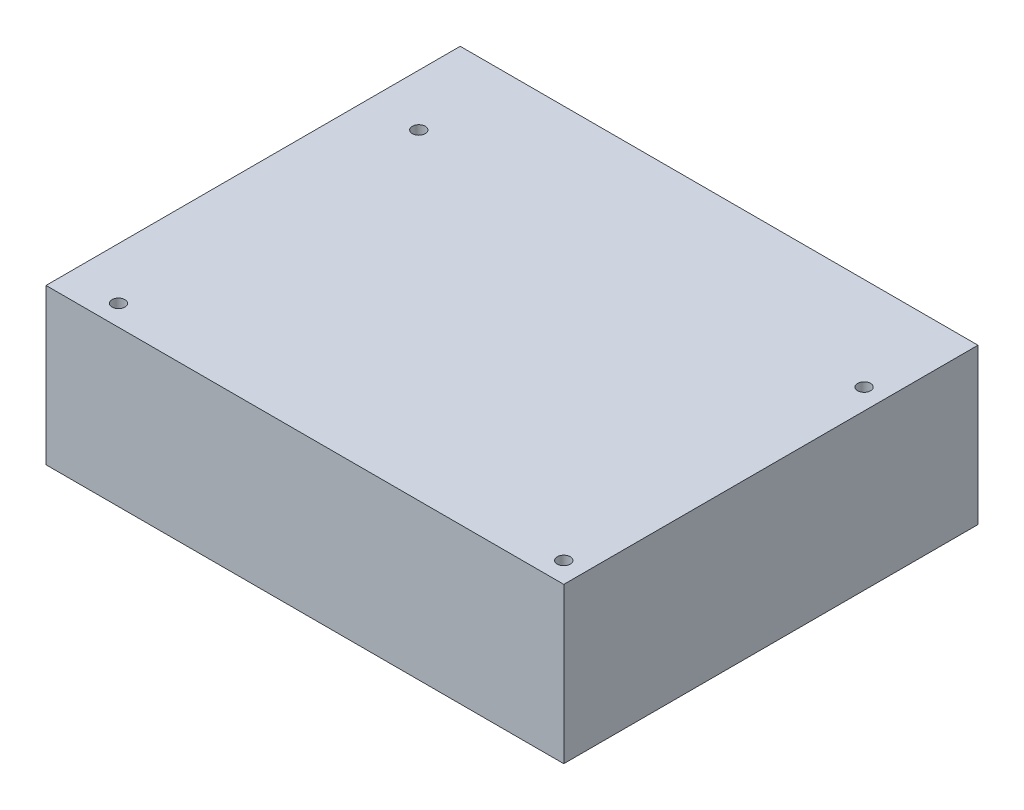
ISO-10303-21;
HEADER;
FILE_DESCRIPTION(('STEP AP214'),'2;1');
FILE_NAME('part.step','',(''),(''),'','','');
FILE_SCHEMA(('AUTOMOTIVE_DESIGN { 1 0 10303 214 1 1 1 1 }'));
ENDSEC;
DATA;
#1=APPLICATION_CONTEXT('core data for automotive mechanical design processes');
#2=APPLICATION_PROTOCOL_DEFINITION('international standard','automotive_design',2000,#1);
#3=PRODUCT_CONTEXT('',#1,'mechanical');
#4=PRODUCT('Part','Part','',(#3));
#5=PRODUCT_RELATED_PRODUCT_CATEGORY('part','',(#4));
#6=PRODUCT_DEFINITION_FORMATION('','',#4);
#7=PRODUCT_DEFINITION_CONTEXT('part definition',#1,'design');
#8=PRODUCT_DEFINITION('design','',#6,#7);
#9=PRODUCT_DEFINITION_SHAPE('','',#8);
#10=(LENGTH_UNIT() NAMED_UNIT(*) SI_UNIT(.MILLI.,.METRE.));
#11=(NAMED_UNIT(*) PLANE_ANGLE_UNIT() SI_UNIT($,.RADIAN.));
#12=(NAMED_UNIT(*) SI_UNIT($,.STERADIAN.) SOLID_ANGLE_UNIT());
#13=UNCERTAINTY_MEASURE_WITH_UNIT(LENGTH_MEASURE(1.E-05),#10,'distance_accuracy_value','');
#14=(GEOMETRIC_REPRESENTATION_CONTEXT(3) GLOBAL_UNCERTAINTY_ASSIGNED_CONTEXT((#13)) GLOBAL_UNIT_ASSIGNED_CONTEXT((#10,
#11,#12)) REPRESENTATION_CONTEXT('',''));
#15=CARTESIAN_POINT('',(0.,0.,0.));
#16=DIRECTION('',(0.,0.,1.));
#17=DIRECTION('',(1.,0.,0.));
#18=AXIS2_PLACEMENT_3D('',#15,#16,#17);
#19=CARTESIAN_POINT('',(50.,30.,40.));
#20=DIRECTION('',(-1.,0.,0.));
#21=DIRECTION('',(0.,0.,1.));
#22=AXIS2_PLACEMENT_3D('',#19,#20,#21);
#23=PLANE('',#22);
#24=DIRECTION('',(0.,0.,-1.));
#25=VECTOR('',#24,1.);
#26=CARTESIAN_POINT('',(50.,0.,40.));
#27=LINE('',#26,#25);
#28=CARTESIAN_POINT('',(50.,0.,40.));
#29=VERTEX_POINT('',#28);
#30=CARTESIAN_POINT('',(50.,0.,-40.));
#31=VERTEX_POINT('',#30);
#32=EDGE_CURVE('E313',#29,#31,#27,.T.);
#33=ORIENTED_EDGE('',*,*,#32,.T.);
#34=DIRECTION('',(0.,-1.,0.));
#35=VECTOR('',#34,1.);
#36=CARTESIAN_POINT('',(50.,30.,-40.));
#37=LINE('',#36,#35);
#38=CARTESIAN_POINT('',(50.,30.,-40.));
#39=VERTEX_POINT('',#38);
#40=EDGE_CURVE('E11',#39,#31,#37,.T.);
#41=ORIENTED_EDGE('',*,*,#40,.F.);
#42=DIRECTION('',(0.,0.,-1.));
#43=VECTOR('',#42,1.);
#44=CARTESIAN_POINT('',(50.,30.,40.));
#45=LINE('',#44,#43);
#46=CARTESIAN_POINT('',(50.,30.,40.));
#47=VERTEX_POINT('',#46);
#48=EDGE_CURVE('E316',#47,#39,#45,.T.);
#49=ORIENTED_EDGE('',*,*,#48,.F.);
#50=DIRECTION('',(0.,-1.,0.));
#51=VECTOR('',#50,1.);
#52=CARTESIAN_POINT('',(50.,30.,40.));
#53=LINE('',#52,#51);
#54=EDGE_CURVE('E326',#47,#29,#53,.T.);
#55=ORIENTED_EDGE('',*,*,#54,.T.);
#56=EDGE_LOOP('',(#33,#41,#49,#55));
#57=FACE_BOUND('',#56,.T.);
#58=ADVANCED_FACE('F41',(#57),#23,.F.);
#59=CARTESIAN_POINT('',(-50.,30.,-40.));
#60=DIRECTION('',(0.,0.,1.));
#61=DIRECTION('',(1.,0.,0.));
#62=AXIS2_PLACEMENT_3D('',#59,#60,#61);
#63=PLANE('',#62);
#64=DIRECTION('',(1.,0.,0.));
#65=VECTOR('',#64,1.);
#66=CARTESIAN_POINT('',(-5.,21.,-40.));
#67=LINE('',#66,#65);
#68=CARTESIAN_POINT('',(-20.,21.,-40.));
#69=VERTEX_POINT('',#68);
#70=CARTESIAN_POINT('',(-5.,21.,-40.));
#71=VERTEX_POINT('',#70);
#72=EDGE_CURVE('E236',#69,#71,#67,.T.);
#73=ORIENTED_EDGE('',*,*,#72,.F.);
#74=DIRECTION('',(0.,1.,0.));
#75=VECTOR('',#74,1.);
#76=CARTESIAN_POINT('',(-20.,15.,-40.));
#77=LINE('',#76,#75);
#78=CARTESIAN_POINT('',(-20.,15.,-40.));
#79=VERTEX_POINT('',#78);
#80=EDGE_CURVE('E55',#79,#69,#77,.T.);
#81=ORIENTED_EDGE('',*,*,#80,.F.);
#82=DIRECTION('',(-1.,0.,0.));
#83=VECTOR('',#82,1.);
#84=CARTESIAN_POINT('',(-5.,15.,-40.));
#85=LINE('',#84,#83);
#86=CARTESIAN_POINT('',(-5.,15.,-40.));
#87=VERTEX_POINT('',#86);
#88=EDGE_CURVE('E229',#87,#79,#85,.T.);
#89=ORIENTED_EDGE('',*,*,#88,.F.);
#90=DIRECTION('',(0.,-1.,0.));
#91=VECTOR('',#90,1.);
#92=CARTESIAN_POINT('',(-5.,15.,-40.));
#93=LINE('',#92,#91);
#94=EDGE_CURVE('E232',#71,#87,#93,.T.);
#95=ORIENTED_EDGE('',*,*,#94,.F.);
#96=EDGE_LOOP('',(#73,#81,#89,#95));
#97=FACE_BOUND('',#96,.T.);
#98=DIRECTION('',(1.,0.,0.));
#99=VECTOR('',#98,1.);
#100=CARTESIAN_POINT('',(20.,9.,-40.));
#101=LINE('',#100,#99);
#102=CARTESIAN_POINT('',(5.,9.,-40.));
#103=VERTEX_POINT('',#102);
#104=CARTESIAN_POINT('',(20.,9.,-40.));
#105=VERTEX_POINT('',#104);
#106=EDGE_CURVE('E264',#103,#105,#101,.T.);
#107=ORIENTED_EDGE('',*,*,#106,.F.);
#108=DIRECTION('',(0.,1.,0.));
#109=VECTOR('',#108,1.);
#110=CARTESIAN_POINT('',(5.,3.,-40.));
#111=LINE('',#110,#109);
#112=CARTESIAN_POINT('',(5.,3.,-40.));
#113=VERTEX_POINT('',#112);
#114=EDGE_CURVE('E63',#113,#103,#111,.T.);
#115=ORIENTED_EDGE('',*,*,#114,.F.);
#116=DIRECTION('',(-1.,0.,0.));
#117=VECTOR('',#116,1.);
#118=CARTESIAN_POINT('',(20.,3.,-40.));
#119=LINE('',#118,#117);
#120=CARTESIAN_POINT('',(20.,3.,-40.));
#121=VERTEX_POINT('',#120);
#122=EDGE_CURVE('E257',#121,#113,#119,.T.);
#123=ORIENTED_EDGE('',*,*,#122,.F.);
#124=DIRECTION('',(0.,-1.,0.));
#125=VECTOR('',#124,1.);
#126=CARTESIAN_POINT('',(20.,3.,-40.));
#127=LINE('',#126,#125);
#128=EDGE_CURVE('E260',#105,#121,#127,.T.);
#129=ORIENTED_EDGE('',*,*,#128,.F.);
#130=EDGE_LOOP('',(#107,#115,#123,#129));
#131=FACE_BOUND('',#130,.T.);
#132=DIRECTION('',(1.,0.,0.));
#133=VECTOR('',#132,1.);
#134=CARTESIAN_POINT('',(-5.,9.,-40.));
#135=LINE('',#134,#133);
#136=CARTESIAN_POINT('',(-20.,9.,-40.));
#137=VERTEX_POINT('',#136);
#138=CARTESIAN_POINT('',(-5.,9.,-40.));
#139=VERTEX_POINT('',#138);
#140=EDGE_CURVE('E202',#137,#139,#135,.T.);
#141=ORIENTED_EDGE('',*,*,#140,.F.);
#142=DIRECTION('',(0.,1.,0.));
#143=VECTOR('',#142,1.);
#144=CARTESIAN_POINT('',(-20.,3.,-40.));
#145=LINE('',#144,#143);
#146=CARTESIAN_POINT('',(-20.,3.,-40.));
#147=VERTEX_POINT('',#146);
#148=EDGE_CURVE('E180',#147,#137,#145,.T.);
#149=ORIENTED_EDGE('',*,*,#148,.F.);
#150=DIRECTION('',(-1.,0.,0.));
#151=VECTOR('',#150,1.);
#152=CARTESIAN_POINT('',(-5.,3.,-40.));
#153=LINE('',#152,#151);
#154=CARTESIAN_POINT('',(-5.,3.,-40.));
#155=VERTEX_POINT('',#154);
#156=EDGE_CURVE('E191',#155,#147,#153,.T.);
#157=ORIENTED_EDGE('',*,*,#156,.F.);
#158=DIRECTION('',(0.,-1.,0.));
#159=VECTOR('',#158,1.);
#160=CARTESIAN_POINT('',(-5.,3.,-40.));
#161=LINE('',#160,#159);
#162=EDGE_CURVE('E196',#139,#155,#161,.T.);
#163=ORIENTED_EDGE('',*,*,#162,.F.);
#164=EDGE_LOOP('',(#141,#149,#157,#163));
#165=FACE_BOUND('',#164,.T.);
#166=DIRECTION('',(1.,0.,0.));
#167=VECTOR('',#166,1.);
#168=CARTESIAN_POINT('',(20.,21.,-40.));
#169=LINE('',#168,#167);
#170=CARTESIAN_POINT('',(5.,21.,-40.));
#171=VERTEX_POINT('',#170);
#172=CARTESIAN_POINT('',(20.,21.,-40.));
#173=VERTEX_POINT('',#172);
#174=EDGE_CURVE('E293',#171,#173,#169,.T.);
#175=ORIENTED_EDGE('',*,*,#174,.F.);
#176=DIRECTION('',(0.,1.,0.));
#177=VECTOR('',#176,1.);
#178=CARTESIAN_POINT('',(5.,15.,-40.));
#179=LINE('',#178,#177);
#180=CARTESIAN_POINT('',(5.,15.,-40.));
#181=VERTEX_POINT('',#180);
#182=EDGE_CURVE('E240',#181,#171,#179,.T.);
#183=ORIENTED_EDGE('',*,*,#182,.F.);
#184=DIRECTION('',(-1.,0.,0.));
#185=VECTOR('',#184,1.);
#186=CARTESIAN_POINT('',(20.,15.,-40.));
#187=LINE('',#186,#185);
#188=CARTESIAN_POINT('',(20.,15.,-40.));
#189=VERTEX_POINT('',#188);
#190=EDGE_CURVE('E282',#189,#181,#187,.T.);
#191=ORIENTED_EDGE('',*,*,#190,.F.);
#192=DIRECTION('',(0.,-1.,0.));
#193=VECTOR('',#192,1.);
#194=CARTESIAN_POINT('',(20.,15.,-40.));
#195=LINE('',#194,#193);
#196=EDGE_CURVE('E296',#173,#189,#195,.T.);
#197=ORIENTED_EDGE('',*,*,#196,.F.);
#198=EDGE_LOOP('',(#175,#183,#191,#197));
#199=FACE_BOUND('',#198,.T.);
#200=CARTESIAN_POINT('',(41.,9.,-40.));
#201=DIRECTION('',(0.,0.,-1.));
#202=DIRECTION('',(-1.,0.,0.));
#203=AXIS2_PLACEMENT_3D('',#200,#201,#202);
#204=CIRCLE('',#203,5.);
#205=CARTESIAN_POINT('',(36.,9.,-40.));
#206=VERTEX_POINT('',#205);
#207=EDGE_CURVE('E303',#206,#206,#204,.T.);
#208=ORIENTED_EDGE('',*,*,#207,.F.);
#209=EDGE_LOOP('',(#208));
#210=FACE_BOUND('',#209,.T.);
#211=DIRECTION('',(-1.,0.,0.));
#212=VECTOR('',#211,1.);
#213=CARTESIAN_POINT('',(-50.,0.,-40.));
#214=LINE('',#213,#212);
#215=CARTESIAN_POINT('',(-50.,0.,-40.));
#216=VERTEX_POINT('',#215);
#217=EDGE_CURVE('E329',#31,#216,#214,.T.);
#218=ORIENTED_EDGE('',*,*,#217,.T.);
#219=DIRECTION('',(0.,-1.,0.));
#220=VECTOR('',#219,1.);
#221=CARTESIAN_POINT('',(-50.,30.,-40.));
#222=LINE('',#221,#220);
#223=CARTESIAN_POINT('',(-50.,30.,-40.));
#224=VERTEX_POINT('',#223);
#225=EDGE_CURVE('E48',#224,#216,#222,.T.);
#226=ORIENTED_EDGE('',*,*,#225,.F.);
#227=DIRECTION('',(-1.,0.,0.));
#228=VECTOR('',#227,1.);
#229=CARTESIAN_POINT('',(-50.,30.,-40.));
#230=LINE('',#229,#228);
#231=EDGE_CURVE('E319',#39,#224,#230,.T.);
#232=ORIENTED_EDGE('',*,*,#231,.F.);
#233=ORIENTED_EDGE('',*,*,#40,.T.);
#234=EDGE_LOOP('',(#218,#226,#232,#233));
#235=FACE_BOUND('',#234,.T.);
#236=ADVANCED_FACE('F199',(#97,#131,#165,#199,#210,#235),#63,.F.);
#237=CARTESIAN_POINT('',(-50.,30.,40.));
#238=DIRECTION('',(1.,0.,0.));
#239=DIRECTION('',(0.,0.,-1.));
#240=AXIS2_PLACEMENT_3D('',#237,#238,#239);
#241=PLANE('',#240);
#242=DIRECTION('',(0.,0.,1.));
#243=VECTOR('',#242,1.);
#244=CARTESIAN_POINT('',(-50.,0.,40.));
#245=LINE('',#244,#243);
#246=CARTESIAN_POINT('',(-50.,0.,40.));
#247=VERTEX_POINT('',#246);
#248=EDGE_CURVE('E331',#216,#247,#245,.T.);
#249=ORIENTED_EDGE('',*,*,#248,.T.);
#250=DIRECTION('',(0.,-1.,0.));
#251=VECTOR('',#250,1.);
#252=CARTESIAN_POINT('',(-50.,30.,40.));
#253=LINE('',#252,#251);
#254=CARTESIAN_POINT('',(-50.,30.,40.));
#255=VERTEX_POINT('',#254);
#256=EDGE_CURVE('E336',#255,#247,#253,.T.);
#257=ORIENTED_EDGE('',*,*,#256,.F.);
#258=DIRECTION('',(0.,0.,1.));
#259=VECTOR('',#258,1.);
#260=CARTESIAN_POINT('',(-50.,30.,40.));
#261=LINE('',#260,#259);
#262=EDGE_CURVE('E322',#224,#255,#261,.T.);
#263=ORIENTED_EDGE('',*,*,#262,.F.);
#264=ORIENTED_EDGE('',*,*,#225,.T.);
#265=EDGE_LOOP('',(#249,#257,#263,#264));
#266=FACE_BOUND('',#265,.T.);
#267=ADVANCED_FACE('F343',(#266),#241,.F.);
#268=CARTESIAN_POINT('',(-50.,30.,40.));
#269=DIRECTION('',(0.,0.,-1.));
#270=DIRECTION('',(-1.,0.,0.));
#271=AXIS2_PLACEMENT_3D('',#268,#269,#270);
#272=PLANE('',#271);
#273=DIRECTION('',(1.,0.,0.));
#274=VECTOR('',#273,1.);
#275=CARTESIAN_POINT('',(-50.,0.,40.));
#276=LINE('',#275,#274);
#277=EDGE_CURVE('E320',#247,#29,#276,.T.);
#278=ORIENTED_EDGE('',*,*,#277,.T.);
#279=ORIENTED_EDGE('',*,*,#54,.F.);
#280=DIRECTION('',(1.,0.,0.));
#281=VECTOR('',#280,1.);
#282=CARTESIAN_POINT('',(-50.,30.,40.));
#283=LINE('',#282,#281);
#284=EDGE_CURVE('E324',#255,#47,#283,.T.);
#285=ORIENTED_EDGE('',*,*,#284,.F.);
#286=ORIENTED_EDGE('',*,*,#256,.T.);
#287=EDGE_LOOP('',(#278,#279,#285,#286));
#288=FACE_BOUND('',#287,.T.);
#289=ADVANCED_FACE('F352',(#288),#272,.F.);
#290=CARTESIAN_POINT('',(0.,30.,0.));
#291=DIRECTION('',(0.,-1.,0.));
#292=DIRECTION('',(0.,0.,-1.));
#293=AXIS2_PLACEMENT_3D('',#290,#291,#292);
#294=PLANE('',#293);
#295=CARTESIAN_POINT('',(46.,30.,-22.));
#296=DIRECTION('',(0.,-1.,0.));
#297=DIRECTION('',(0.,0.,-1.));
#298=AXIS2_PLACEMENT_3D('',#295,#296,#297);
#299=CIRCLE('',#298,1.25);
#300=CARTESIAN_POINT('',(46.,30.,-23.25));
#301=VERTEX_POINT('',#300);
#302=EDGE_CURVE('E188',#301,#301,#299,.T.);
#303=ORIENTED_EDGE('',*,*,#302,.T.);
#304=EDGE_LOOP('',(#303));
#305=FACE_BOUND('',#304,.T.);
#306=CARTESIAN_POINT('',(-40.,30.,-22.));
#307=DIRECTION('',(0.,-1.,0.));
#308=DIRECTION('',(0.,0.,-1.));
#309=AXIS2_PLACEMENT_3D('',#306,#307,#308);
#310=CIRCLE('',#309,1.25);
#311=CARTESIAN_POINT('',(-40.,30.,-23.25));
#312=VERTEX_POINT('',#311);
#313=EDGE_CURVE('E484',#312,#312,#310,.T.);
#314=ORIENTED_EDGE('',*,*,#313,.T.);
#315=EDGE_LOOP('',(#314));
#316=FACE_BOUND('',#315,.T.);
#317=CARTESIAN_POINT('',(-40.,30.,36.));
#318=DIRECTION('',(0.,-1.,0.));
#319=DIRECTION('',(0.,0.,-1.));
#320=AXIS2_PLACEMENT_3D('',#317,#318,#319);
#321=CIRCLE('',#320,1.25);
#322=CARTESIAN_POINT('',(-40.,30.,34.75));
#323=VERTEX_POINT('',#322);
#324=EDGE_CURVE('E482',#323,#323,#321,.T.);
#325=ORIENTED_EDGE('',*,*,#324,.T.);
#326=EDGE_LOOP('',(#325));
#327=FACE_BOUND('',#326,.T.);
#328=CARTESIAN_POINT('',(46.,30.,36.));
#329=DIRECTION('',(0.,-1.,0.));
#330=DIRECTION('',(0.,0.,-1.));
#331=AXIS2_PLACEMENT_3D('',#328,#329,#330);
#332=CIRCLE('',#331,1.25);
#333=CARTESIAN_POINT('',(46.,30.,34.75));
#334=VERTEX_POINT('',#333);
#335=EDGE_CURVE('E485',#334,#334,#332,.T.);
#336=ORIENTED_EDGE('',*,*,#335,.T.);
#337=EDGE_LOOP('',(#336));
#338=FACE_BOUND('',#337,.T.);
#339=ORIENTED_EDGE('',*,*,#48,.T.);
#340=ORIENTED_EDGE('',*,*,#231,.T.);
#341=ORIENTED_EDGE('',*,*,#262,.T.);
#342=ORIENTED_EDGE('',*,*,#284,.T.);
#343=EDGE_LOOP('',(#339,#340,#341,#342));
#344=FACE_BOUND('',#343,.T.);
#345=ADVANCED_FACE('F358',(#305,#316,#327,#338,#344),#294,.F.);
#346=CARTESIAN_POINT('',(0.,0.,0.));
#347=DIRECTION('',(0.,-1.,0.));
#348=DIRECTION('',(0.,0.,-1.));
#349=AXIS2_PLACEMENT_3D('',#346,#347,#348);
#350=PLANE('',#349);
#351=CARTESIAN_POINT('',(46.,0.,-22.));
#352=DIRECTION('',(0.,-1.,0.));
#353=DIRECTION('',(0.,0.,-1.));
#354=AXIS2_PLACEMENT_3D('',#351,#352,#353);
#355=CIRCLE('',#354,1.25);
#356=CARTESIAN_POINT('',(46.,0.,-23.25));
#357=VERTEX_POINT('',#356);
#358=EDGE_CURVE('E511',#357,#357,#355,.T.);
#359=ORIENTED_EDGE('',*,*,#358,.F.);
#360=EDGE_LOOP('',(#359));
#361=FACE_BOUND('',#360,.T.);
#362=CARTESIAN_POINT('',(-40.,0.,-22.));
#363=DIRECTION('',(0.,-1.,0.));
#364=DIRECTION('',(0.,0.,-1.));
#365=AXIS2_PLACEMENT_3D('',#362,#363,#364);
#366=CIRCLE('',#365,1.25);
#367=CARTESIAN_POINT('',(-40.,0.,-23.25));
#368=VERTEX_POINT('',#367);
#369=EDGE_CURVE('E514',#368,#368,#366,.T.);
#370=ORIENTED_EDGE('',*,*,#369,.F.);
#371=EDGE_LOOP('',(#370));
#372=FACE_BOUND('',#371,.T.);
#373=CARTESIAN_POINT('',(-40.,0.,36.));
#374=DIRECTION('',(0.,-1.,0.));
#375=DIRECTION('',(0.,0.,-1.));
#376=AXIS2_PLACEMENT_3D('',#373,#374,#375);
#377=CIRCLE('',#376,1.25);
#378=CARTESIAN_POINT('',(-40.,0.,34.75));
#379=VERTEX_POINT('',#378);
#380=EDGE_CURVE('E479',#379,#379,#377,.T.);
#381=ORIENTED_EDGE('',*,*,#380,.F.);
#382=EDGE_LOOP('',(#381));
#383=FACE_BOUND('',#382,.T.);
#384=CARTESIAN_POINT('',(46.,0.,36.));
#385=DIRECTION('',(0.,-1.,0.));
#386=DIRECTION('',(0.,0.,-1.));
#387=AXIS2_PLACEMENT_3D('',#384,#385,#386);
#388=CIRCLE('',#387,1.25);
#389=CARTESIAN_POINT('',(46.,0.,34.75));
#390=VERTEX_POINT('',#389);
#391=EDGE_CURVE('E490',#390,#390,#388,.T.);
#392=ORIENTED_EDGE('',*,*,#391,.F.);
#393=EDGE_LOOP('',(#392));
#394=FACE_BOUND('',#393,.T.);
#395=ORIENTED_EDGE('',*,*,#32,.F.);
#396=ORIENTED_EDGE('',*,*,#277,.F.);
#397=ORIENTED_EDGE('',*,*,#248,.F.);
#398=ORIENTED_EDGE('',*,*,#217,.F.);
#399=EDGE_LOOP('',(#395,#396,#397,#398));
#400=FACE_BOUND('',#399,.T.);
#401=ADVANCED_FACE('F349',(#361,#372,#383,#394,#400),#350,.T.);
#402=CARTESIAN_POINT('',(41.,9.,-35.));
#403=DIRECTION('',(0.,0.,-1.));
#404=DIRECTION('',(-1.,0.,0.));
#405=AXIS2_PLACEMENT_3D('',#402,#403,#404);
#406=CYLINDRICAL_SURFACE('',#405,5.);
#407=CARTESIAN_POINT('',(41.,9.,-35.));
#408=DIRECTION('',(0.,0.,-1.));
#409=DIRECTION('',(-1.,0.,0.));
#410=AXIS2_PLACEMENT_3D('',#407,#408,#409);
#411=CIRCLE('',#410,5.);
#412=CARTESIAN_POINT('',(36.,9.,-35.));
#413=VERTEX_POINT('',#412);
#414=EDGE_CURVE('E310',#413,#413,#411,.T.);
#415=ORIENTED_EDGE('',*,*,#414,.F.);
#416=EDGE_LOOP('',(#415));
#417=FACE_BOUND('',#416,.T.);
#418=ORIENTED_EDGE('',*,*,#207,.T.);
#419=EDGE_LOOP('',(#418));
#420=FACE_BOUND('',#419,.T.);
#421=ADVANCED_FACE('F375',(#417,#420),#406,.F.);
#422=CARTESIAN_POINT('',(41.,9.,-35.));
#423=DIRECTION('',(0.,0.,-1.));
#424=DIRECTION('',(-1.,0.,0.));
#425=AXIS2_PLACEMENT_3D('',#422,#423,#424);
#426=PLANE('',#425);
#427=ORIENTED_EDGE('',*,*,#414,.T.);
#428=EDGE_LOOP('',(#427));
#429=FACE_BOUND('',#428,.T.);
#430=ADVANCED_FACE('F382',(#429),#426,.T.);
#431=CARTESIAN_POINT('',(5.,15.,-35.));
#432=DIRECTION('',(-1.,0.,0.));
#433=DIRECTION('',(0.,0.,1.));
#434=AXIS2_PLACEMENT_3D('',#431,#432,#433);
#435=PLANE('',#434);
#436=ORIENTED_EDGE('',*,*,#182,.T.);
#437=DIRECTION('',(0.,0.,-1.));
#438=VECTOR('',#437,1.);
#439=CARTESIAN_POINT('',(5.,21.,-35.));
#440=LINE('',#439,#438);
#441=CARTESIAN_POINT('',(5.,21.,-35.));
#442=VERTEX_POINT('',#441);
#443=EDGE_CURVE('E291',#442,#171,#440,.T.);
#444=ORIENTED_EDGE('',*,*,#443,.F.);
#445=DIRECTION('',(0.,1.,0.));
#446=VECTOR('',#445,1.);
#447=CARTESIAN_POINT('',(5.,15.,-35.));
#448=LINE('',#447,#446);
#449=CARTESIAN_POINT('',(5.,15.,-35.));
#450=VERTEX_POINT('',#449);
#451=EDGE_CURVE('E278',#450,#442,#448,.T.);
#452=ORIENTED_EDGE('',*,*,#451,.F.);
#453=DIRECTION('',(0.,0.,-1.));
#454=VECTOR('',#453,1.);
#455=CARTESIAN_POINT('',(5.,15.,-35.));
#456=LINE('',#455,#454);
#457=EDGE_CURVE('E301',#450,#181,#456,.T.);
#458=ORIENTED_EDGE('',*,*,#457,.T.);
#459=EDGE_LOOP('',(#436,#444,#452,#458));
#460=FACE_BOUND('',#459,.T.);
#461=ADVANCED_FACE('F385',(#460),#435,.F.);
#462=CARTESIAN_POINT('',(20.,15.,-35.));
#463=DIRECTION('',(0.,-1.,0.));
#464=DIRECTION('',(0.,0.,-1.));
#465=AXIS2_PLACEMENT_3D('',#462,#463,#464);
#466=PLANE('',#465);
#467=ORIENTED_EDGE('',*,*,#190,.T.);
#468=ORIENTED_EDGE('',*,*,#457,.F.);
#469=DIRECTION('',(-1.,0.,0.));
#470=VECTOR('',#469,1.);
#471=CARTESIAN_POINT('',(20.,15.,-35.));
#472=LINE('',#471,#470);
#473=CARTESIAN_POINT('',(20.,15.,-35.));
#474=VERTEX_POINT('',#473);
#475=EDGE_CURVE('E288',#474,#450,#472,.T.);
#476=ORIENTED_EDGE('',*,*,#475,.F.);
#477=DIRECTION('',(0.,0.,-1.));
#478=VECTOR('',#477,1.);
#479=CARTESIAN_POINT('',(20.,15.,-35.));
#480=LINE('',#479,#478);
#481=EDGE_CURVE('E304',#474,#189,#480,.T.);
#482=ORIENTED_EDGE('',*,*,#481,.T.);
#483=EDGE_LOOP('',(#467,#468,#476,#482));
#484=FACE_BOUND('',#483,.T.);
#485=ADVANCED_FACE('F388',(#484),#466,.F.);
#486=CARTESIAN_POINT('',(20.,15.,-35.));
#487=DIRECTION('',(1.,0.,0.));
#488=DIRECTION('',(0.,0.,-1.));
#489=AXIS2_PLACEMENT_3D('',#486,#487,#488);
#490=PLANE('',#489);
#491=ORIENTED_EDGE('',*,*,#196,.T.);
#492=ORIENTED_EDGE('',*,*,#481,.F.);
#493=DIRECTION('',(0.,-1.,0.));
#494=VECTOR('',#493,1.);
#495=CARTESIAN_POINT('',(20.,15.,-35.));
#496=LINE('',#495,#494);
#497=CARTESIAN_POINT('',(20.,21.,-35.));
#498=VERTEX_POINT('',#497);
#499=EDGE_CURVE('E285',#498,#474,#496,.T.);
#500=ORIENTED_EDGE('',*,*,#499,.F.);
#501=DIRECTION('',(0.,0.,-1.));
#502=VECTOR('',#501,1.);
#503=CARTESIAN_POINT('',(20.,21.,-35.));
#504=LINE('',#503,#502);
#505=EDGE_CURVE('E306',#498,#173,#504,.T.);
#506=ORIENTED_EDGE('',*,*,#505,.T.);
#507=EDGE_LOOP('',(#491,#492,#500,#506));
#508=FACE_BOUND('',#507,.T.);
#509=ADVANCED_FACE('F394',(#508),#490,.F.);
#510=CARTESIAN_POINT('',(20.,21.,-35.));
#511=DIRECTION('',(0.,1.,0.));
#512=DIRECTION('',(0.,0.,1.));
#513=AXIS2_PLACEMENT_3D('',#510,#511,#512);
#514=PLANE('',#513);
#515=ORIENTED_EDGE('',*,*,#174,.T.);
#516=ORIENTED_EDGE('',*,*,#505,.F.);
#517=DIRECTION('',(1.,0.,0.));
#518=VECTOR('',#517,1.);
#519=CARTESIAN_POINT('',(20.,21.,-35.));
#520=LINE('',#519,#518);
#521=EDGE_CURVE('E281',#442,#498,#520,.T.);
#522=ORIENTED_EDGE('',*,*,#521,.F.);
#523=ORIENTED_EDGE('',*,*,#443,.T.);
#524=EDGE_LOOP('',(#515,#516,#522,#523));
#525=FACE_BOUND('',#524,.T.);
#526=ADVANCED_FACE('F390',(#525),#514,.F.);
#527=CARTESIAN_POINT('',(0.,0.,-35.));
#528=DIRECTION('',(0.,0.,1.));
#529=DIRECTION('',(1.,0.,0.));
#530=AXIS2_PLACEMENT_3D('',#527,#528,#529);
#531=PLANE('',#530);
#532=ORIENTED_EDGE('',*,*,#451,.T.);
#533=ORIENTED_EDGE('',*,*,#521,.T.);
#534=ORIENTED_EDGE('',*,*,#499,.T.);
#535=ORIENTED_EDGE('',*,*,#475,.T.);
#536=EDGE_LOOP('',(#532,#533,#534,#535));
#537=FACE_BOUND('',#536,.T.);
#538=ADVANCED_FACE('F393',(#537),#531,.F.);
#539=CARTESIAN_POINT('',(-20.,3.,-35.));
#540=DIRECTION('',(-1.,0.,0.));
#541=DIRECTION('',(0.,0.,1.));
#542=AXIS2_PLACEMENT_3D('',#539,#540,#541);
#543=PLANE('',#542);
#544=ORIENTED_EDGE('',*,*,#148,.T.);
#545=DIRECTION('',(0.,0.,-1.));
#546=VECTOR('',#545,1.);
#547=CARTESIAN_POINT('',(-20.,9.,-35.));
#548=LINE('',#547,#546);
#549=CARTESIAN_POINT('',(-20.,9.,-35.));
#550=VERTEX_POINT('',#549);
#551=EDGE_CURVE('E213',#550,#137,#548,.T.);
#552=ORIENTED_EDGE('',*,*,#551,.F.);
#553=DIRECTION('',(0.,1.,0.));
#554=VECTOR('',#553,1.);
#555=CARTESIAN_POINT('',(-20.,3.,-35.));
#556=LINE('',#555,#554);
#557=CARTESIAN_POINT('',(-20.,3.,-35.));
#558=VERTEX_POINT('',#557);
#559=EDGE_CURVE('E183',#558,#550,#556,.T.);
#560=ORIENTED_EDGE('',*,*,#559,.F.);
#561=DIRECTION('',(0.,0.,-1.));
#562=VECTOR('',#561,1.);
#563=CARTESIAN_POINT('',(-20.,3.,-35.));
#564=LINE('',#563,#562);
#565=EDGE_CURVE('E176',#558,#147,#564,.T.);
#566=ORIENTED_EDGE('',*,*,#565,.T.);
#567=EDGE_LOOP('',(#544,#552,#560,#566));
#568=FACE_BOUND('',#567,.T.);
#569=ADVANCED_FACE('F178',(#568),#543,.F.);
#570=CARTESIAN_POINT('',(-5.,3.,-35.));
#571=DIRECTION('',(0.,-1.,0.));
#572=DIRECTION('',(0.,0.,-1.));
#573=AXIS2_PLACEMENT_3D('',#570,#571,#572);
#574=PLANE('',#573);
#575=ORIENTED_EDGE('',*,*,#156,.T.);
#576=ORIENTED_EDGE('',*,*,#565,.F.);
#577=DIRECTION('',(-1.,0.,0.));
#578=VECTOR('',#577,1.);
#579=CARTESIAN_POINT('',(-5.,3.,-35.));
#580=LINE('',#579,#578);
#581=CARTESIAN_POINT('',(-5.,3.,-35.));
#582=VERTEX_POINT('',#581);
#583=EDGE_CURVE('E210',#582,#558,#580,.T.);
#584=ORIENTED_EDGE('',*,*,#583,.F.);
#585=DIRECTION('',(0.,0.,-1.));
#586=VECTOR('',#585,1.);
#587=CARTESIAN_POINT('',(-5.,3.,-35.));
#588=LINE('',#587,#586);
#589=EDGE_CURVE('E187',#582,#155,#588,.T.);
#590=ORIENTED_EDGE('',*,*,#589,.T.);
#591=EDGE_LOOP('',(#575,#576,#584,#590));
#592=FACE_BOUND('',#591,.T.);
#593=ADVANCED_FACE('F192',(#592),#574,.F.);
#594=CARTESIAN_POINT('',(-5.,3.,-35.));
#595=DIRECTION('',(1.,0.,0.));
#596=DIRECTION('',(0.,0.,-1.));
#597=AXIS2_PLACEMENT_3D('',#594,#595,#596);
#598=PLANE('',#597);
#599=ORIENTED_EDGE('',*,*,#162,.T.);
#600=ORIENTED_EDGE('',*,*,#589,.F.);
#601=DIRECTION('',(0.,-1.,0.));
#602=VECTOR('',#601,1.);
#603=CARTESIAN_POINT('',(-5.,3.,-35.));
#604=LINE('',#603,#602);
#605=CARTESIAN_POINT('',(-5.,9.,-35.));
#606=VERTEX_POINT('',#605);
#607=EDGE_CURVE('E212',#606,#582,#604,.T.);
#608=ORIENTED_EDGE('',*,*,#607,.F.);
#609=DIRECTION('',(0.,0.,-1.));
#610=VECTOR('',#609,1.);
#611=CARTESIAN_POINT('',(-5.,9.,-35.));
#612=LINE('',#611,#610);
#613=EDGE_CURVE('E497',#606,#139,#612,.T.);
#614=ORIENTED_EDGE('',*,*,#613,.T.);
#615=EDGE_LOOP('',(#599,#600,#608,#614));
#616=FACE_BOUND('',#615,.T.);
#617=ADVANCED_FACE('F451',(#616),#598,.F.);
#618=CARTESIAN_POINT('',(-5.,9.,-35.));
#619=DIRECTION('',(0.,1.,0.));
#620=DIRECTION('',(0.,0.,1.));
#621=AXIS2_PLACEMENT_3D('',#618,#619,#620);
#622=PLANE('',#621);
#623=ORIENTED_EDGE('',*,*,#140,.T.);
#624=ORIENTED_EDGE('',*,*,#613,.F.);
#625=DIRECTION('',(1.,0.,0.));
#626=VECTOR('',#625,1.);
#627=CARTESIAN_POINT('',(-5.,9.,-35.));
#628=LINE('',#627,#626);
#629=EDGE_CURVE('E216',#550,#606,#628,.T.);
#630=ORIENTED_EDGE('',*,*,#629,.F.);
#631=ORIENTED_EDGE('',*,*,#551,.T.);
#632=EDGE_LOOP('',(#623,#624,#630,#631));
#633=FACE_BOUND('',#632,.T.);
#634=ADVANCED_FACE('F447',(#633),#622,.F.);
#635=CARTESIAN_POINT('',(0.,0.,-35.));
#636=DIRECTION('',(0.,0.,1.));
#637=DIRECTION('',(1.,0.,0.));
#638=AXIS2_PLACEMENT_3D('',#635,#636,#637);
#639=PLANE('',#638);
#640=ORIENTED_EDGE('',*,*,#559,.T.);
#641=ORIENTED_EDGE('',*,*,#629,.T.);
#642=ORIENTED_EDGE('',*,*,#607,.T.);
#643=ORIENTED_EDGE('',*,*,#583,.T.);
#644=EDGE_LOOP('',(#640,#641,#642,#643));
#645=FACE_BOUND('',#644,.T.);
#646=ADVANCED_FACE('F425',(#645),#639,.F.);
#647=CARTESIAN_POINT('',(5.,3.,-35.));
#648=DIRECTION('',(-1.,0.,0.));
#649=DIRECTION('',(0.,0.,1.));
#650=AXIS2_PLACEMENT_3D('',#647,#648,#649);
#651=PLANE('',#650);
#652=ORIENTED_EDGE('',*,*,#114,.T.);
#653=DIRECTION('',(0.,0.,-1.));
#654=VECTOR('',#653,1.);
#655=CARTESIAN_POINT('',(5.,9.,-35.));
#656=LINE('',#655,#654);
#657=CARTESIAN_POINT('',(5.,9.,-35.));
#658=VERTEX_POINT('',#657);
#659=EDGE_CURVE('E251',#658,#103,#656,.T.);
#660=ORIENTED_EDGE('',*,*,#659,.F.);
#661=DIRECTION('',(0.,1.,0.));
#662=VECTOR('',#661,1.);
#663=CARTESIAN_POINT('',(5.,3.,-35.));
#664=LINE('',#663,#662);
#665=CARTESIAN_POINT('',(5.,3.,-35.));
#666=VERTEX_POINT('',#665);
#667=EDGE_CURVE('E261',#666,#658,#664,.T.);
#668=ORIENTED_EDGE('',*,*,#667,.F.);
#669=DIRECTION('',(0.,0.,-1.));
#670=VECTOR('',#669,1.);
#671=CARTESIAN_POINT('',(5.,3.,-35.));
#672=LINE('',#671,#670);
#673=EDGE_CURVE('E203',#666,#113,#672,.T.);
#674=ORIENTED_EDGE('',*,*,#673,.T.);
#675=EDGE_LOOP('',(#652,#660,#668,#674));
#676=FACE_BOUND('',#675,.T.);
#677=ADVANCED_FACE('F415',(#676),#651,.F.);
#678=CARTESIAN_POINT('',(20.,3.,-35.));
#679=DIRECTION('',(0.,-1.,0.));
#680=DIRECTION('',(0.,0.,-1.));
#681=AXIS2_PLACEMENT_3D('',#678,#679,#680);
#682=PLANE('',#681);
#683=ORIENTED_EDGE('',*,*,#122,.T.);
#684=ORIENTED_EDGE('',*,*,#673,.F.);
#685=DIRECTION('',(-1.,0.,0.));
#686=VECTOR('',#685,1.);
#687=CARTESIAN_POINT('',(20.,3.,-35.));
#688=LINE('',#687,#686);
#689=CARTESIAN_POINT('',(20.,3.,-35.));
#690=VERTEX_POINT('',#689);
#691=EDGE_CURVE('E253',#690,#666,#688,.T.);
#692=ORIENTED_EDGE('',*,*,#691,.F.);
#693=DIRECTION('',(0.,0.,-1.));
#694=VECTOR('',#693,1.);
#695=CARTESIAN_POINT('',(20.,3.,-35.));
#696=LINE('',#695,#694);
#697=EDGE_CURVE('E205',#690,#121,#696,.T.);
#698=ORIENTED_EDGE('',*,*,#697,.T.);
#699=EDGE_LOOP('',(#683,#684,#692,#698));
#700=FACE_BOUND('',#699,.T.);
#701=ADVANCED_FACE('F411',(#700),#682,.F.);
#702=CARTESIAN_POINT('',(20.,3.,-35.));
#703=DIRECTION('',(1.,0.,0.));
#704=DIRECTION('',(0.,0.,-1.));
#705=AXIS2_PLACEMENT_3D('',#702,#703,#704);
#706=PLANE('',#705);
#707=ORIENTED_EDGE('',*,*,#128,.T.);
#708=ORIENTED_EDGE('',*,*,#697,.F.);
#709=DIRECTION('',(0.,-1.,0.));
#710=VECTOR('',#709,1.);
#711=CARTESIAN_POINT('',(20.,3.,-35.));
#712=LINE('',#711,#710);
#713=CARTESIAN_POINT('',(20.,9.,-35.));
#714=VERTEX_POINT('',#713);
#715=EDGE_CURVE('E270',#714,#690,#712,.T.);
#716=ORIENTED_EDGE('',*,*,#715,.F.);
#717=DIRECTION('',(0.,0.,-1.));
#718=VECTOR('',#717,1.);
#719=CARTESIAN_POINT('',(20.,9.,-35.));
#720=LINE('',#719,#718);
#721=EDGE_CURVE('E254',#714,#105,#720,.T.);
#722=ORIENTED_EDGE('',*,*,#721,.T.);
#723=EDGE_LOOP('',(#707,#708,#716,#722));
#724=FACE_BOUND('',#723,.T.);
#725=ADVANCED_FACE('F414',(#724),#706,.F.);
#726=CARTESIAN_POINT('',(20.,9.,-35.));
#727=DIRECTION('',(0.,1.,0.));
#728=DIRECTION('',(0.,0.,1.));
#729=AXIS2_PLACEMENT_3D('',#726,#727,#728);
#730=PLANE('',#729);
#731=ORIENTED_EDGE('',*,*,#106,.T.);
#732=ORIENTED_EDGE('',*,*,#721,.F.);
#733=DIRECTION('',(1.,0.,0.));
#734=VECTOR('',#733,1.);
#735=CARTESIAN_POINT('',(20.,9.,-35.));
#736=LINE('',#735,#734);
#737=EDGE_CURVE('E273',#658,#714,#736,.T.);
#738=ORIENTED_EDGE('',*,*,#737,.F.);
#739=ORIENTED_EDGE('',*,*,#659,.T.);
#740=EDGE_LOOP('',(#731,#732,#738,#739));
#741=FACE_BOUND('',#740,.T.);
#742=ADVANCED_FACE('F409',(#741),#730,.F.);
#743=CARTESIAN_POINT('',(0.,0.,-35.));
#744=DIRECTION('',(0.,0.,1.));
#745=DIRECTION('',(1.,0.,0.));
#746=AXIS2_PLACEMENT_3D('',#743,#744,#745);
#747=PLANE('',#746);
#748=ORIENTED_EDGE('',*,*,#667,.T.);
#749=ORIENTED_EDGE('',*,*,#737,.T.);
#750=ORIENTED_EDGE('',*,*,#715,.T.);
#751=ORIENTED_EDGE('',*,*,#691,.T.);
#752=EDGE_LOOP('',(#748,#749,#750,#751));
#753=FACE_BOUND('',#752,.T.);
#754=ADVANCED_FACE('F405',(#753),#747,.F.);
#755=CARTESIAN_POINT('',(-20.,15.,-35.));
#756=DIRECTION('',(-1.,0.,0.));
#757=DIRECTION('',(0.,0.,1.));
#758=AXIS2_PLACEMENT_3D('',#755,#756,#757);
#759=PLANE('',#758);
#760=ORIENTED_EDGE('',*,*,#80,.T.);
#761=DIRECTION('',(0.,0.,-1.));
#762=VECTOR('',#761,1.);
#763=CARTESIAN_POINT('',(-20.,21.,-35.));
#764=LINE('',#763,#762);
#765=CARTESIAN_POINT('',(-20.,21.,-35.));
#766=VERTEX_POINT('',#765);
#767=EDGE_CURVE('E220',#766,#69,#764,.T.);
#768=ORIENTED_EDGE('',*,*,#767,.F.);
#769=DIRECTION('',(0.,1.,0.));
#770=VECTOR('',#769,1.);
#771=CARTESIAN_POINT('',(-20.,15.,-35.));
#772=LINE('',#771,#770);
#773=CARTESIAN_POINT('',(-20.,15.,-35.));
#774=VERTEX_POINT('',#773);
#775=EDGE_CURVE('E233',#774,#766,#772,.T.);
#776=ORIENTED_EDGE('',*,*,#775,.F.);
#777=DIRECTION('',(0.,0.,-1.));
#778=VECTOR('',#777,1.);
#779=CARTESIAN_POINT('',(-20.,15.,-35.));
#780=LINE('',#779,#778);
#781=EDGE_CURVE('E227',#774,#79,#780,.T.);
#782=ORIENTED_EDGE('',*,*,#781,.T.);
#783=EDGE_LOOP('',(#760,#768,#776,#782));
#784=FACE_BOUND('',#783,.T.);
#785=ADVANCED_FACE('F408',(#784),#759,.F.);
#786=CARTESIAN_POINT('',(-5.,15.,-35.));
#787=DIRECTION('',(0.,-1.,0.));
#788=DIRECTION('',(0.,0.,-1.));
#789=AXIS2_PLACEMENT_3D('',#786,#787,#788);
#790=PLANE('',#789);
#791=ORIENTED_EDGE('',*,*,#88,.T.);
#792=ORIENTED_EDGE('',*,*,#781,.F.);
#793=DIRECTION('',(-1.,0.,0.));
#794=VECTOR('',#793,1.);
#795=CARTESIAN_POINT('',(-5.,15.,-35.));
#796=LINE('',#795,#794);
#797=CARTESIAN_POINT('',(-5.,15.,-35.));
#798=VERTEX_POINT('',#797);
#799=EDGE_CURVE('E222',#798,#774,#796,.T.);
#800=ORIENTED_EDGE('',*,*,#799,.F.);
#801=DIRECTION('',(0.,0.,-1.));
#802=VECTOR('',#801,1.);
#803=CARTESIAN_POINT('',(-5.,15.,-35.));
#804=LINE('',#803,#802);
#805=EDGE_CURVE('E225',#798,#87,#804,.T.);
#806=ORIENTED_EDGE('',*,*,#805,.T.);
#807=EDGE_LOOP('',(#791,#792,#800,#806));
#808=FACE_BOUND('',#807,.T.);
#809=ADVANCED_FACE('F432',(#808),#790,.F.);
#810=CARTESIAN_POINT('',(-5.,15.,-35.));
#811=DIRECTION('',(1.,0.,0.));
#812=DIRECTION('',(0.,0.,-1.));
#813=AXIS2_PLACEMENT_3D('',#810,#811,#812);
#814=PLANE('',#813);
#815=ORIENTED_EDGE('',*,*,#94,.T.);
#816=ORIENTED_EDGE('',*,*,#805,.F.);
#817=DIRECTION('',(0.,-1.,0.));
#818=VECTOR('',#817,1.);
#819=CARTESIAN_POINT('',(-5.,15.,-35.));
#820=LINE('',#819,#818);
#821=CARTESIAN_POINT('',(-5.,21.,-35.));
#822=VERTEX_POINT('',#821);
#823=EDGE_CURVE('E243',#822,#798,#820,.T.);
#824=ORIENTED_EDGE('',*,*,#823,.F.);
#825=DIRECTION('',(0.,0.,-1.));
#826=VECTOR('',#825,1.);
#827=CARTESIAN_POINT('',(-5.,21.,-35.));
#828=LINE('',#827,#826);
#829=EDGE_CURVE('E223',#822,#71,#828,.T.);
#830=ORIENTED_EDGE('',*,*,#829,.T.);
#831=EDGE_LOOP('',(#815,#816,#824,#830));
#832=FACE_BOUND('',#831,.T.);
#833=ADVANCED_FACE('F435',(#832),#814,.F.);
#834=CARTESIAN_POINT('',(-5.,21.,-35.));
#835=DIRECTION('',(0.,1.,0.));
#836=DIRECTION('',(0.,0.,1.));
#837=AXIS2_PLACEMENT_3D('',#834,#835,#836);
#838=PLANE('',#837);
#839=ORIENTED_EDGE('',*,*,#72,.T.);
#840=ORIENTED_EDGE('',*,*,#829,.F.);
#841=DIRECTION('',(1.,0.,0.));
#842=VECTOR('',#841,1.);
#843=CARTESIAN_POINT('',(-5.,21.,-35.));
#844=LINE('',#843,#842);
#845=EDGE_CURVE('E246',#766,#822,#844,.T.);
#846=ORIENTED_EDGE('',*,*,#845,.F.);
#847=ORIENTED_EDGE('',*,*,#767,.T.);
#848=EDGE_LOOP('',(#839,#840,#846,#847));
#849=FACE_BOUND('',#848,.T.);
#850=ADVANCED_FACE('F430',(#849),#838,.F.);
#851=CARTESIAN_POINT('',(0.,0.,-35.));
#852=DIRECTION('',(0.,0.,1.));
#853=DIRECTION('',(1.,0.,0.));
#854=AXIS2_PLACEMENT_3D('',#851,#852,#853);
#855=PLANE('',#854);
#856=ORIENTED_EDGE('',*,*,#775,.T.);
#857=ORIENTED_EDGE('',*,*,#845,.T.);
#858=ORIENTED_EDGE('',*,*,#823,.T.);
#859=ORIENTED_EDGE('',*,*,#799,.T.);
#860=EDGE_LOOP('',(#856,#857,#858,#859));
#861=FACE_BOUND('',#860,.T.);
#862=ADVANCED_FACE('F426',(#861),#855,.F.);
#863=CARTESIAN_POINT('',(46.,51.,36.));
#864=DIRECTION('',(0.,-1.,0.));
#865=DIRECTION('',(0.,0.,-1.));
#866=AXIS2_PLACEMENT_3D('',#863,#864,#865);
#867=CYLINDRICAL_SURFACE('',#866,1.25);
#868=ORIENTED_EDGE('',*,*,#391,.T.);
#869=EDGE_LOOP('',(#868));
#870=FACE_BOUND('',#869,.T.);
#871=ORIENTED_EDGE('',*,*,#335,.F.);
#872=EDGE_LOOP('',(#871));
#873=FACE_BOUND('',#872,.T.);
#874=ADVANCED_FACE('F429',(#870,#873),#867,.F.);
#875=CARTESIAN_POINT('',(-40.,51.,36.));
#876=DIRECTION('',(0.,-1.,0.));
#877=DIRECTION('',(0.,0.,-1.));
#878=AXIS2_PLACEMENT_3D('',#875,#876,#877);
#879=CYLINDRICAL_SURFACE('',#878,1.25);
#880=ORIENTED_EDGE('',*,*,#380,.T.);
#881=EDGE_LOOP('',(#880));
#882=FACE_BOUND('',#881,.T.);
#883=ORIENTED_EDGE('',*,*,#324,.F.);
#884=EDGE_LOOP('',(#883));
#885=FACE_BOUND('',#884,.T.);
#886=ADVANCED_FACE('F462',(#882,#885),#879,.F.);
#887=CARTESIAN_POINT('',(-40.,51.,-22.));
#888=DIRECTION('',(0.,-1.,0.));
#889=DIRECTION('',(0.,0.,-1.));
#890=AXIS2_PLACEMENT_3D('',#887,#888,#889);
#891=CYLINDRICAL_SURFACE('',#890,1.25);
#892=ORIENTED_EDGE('',*,*,#369,.T.);
#893=EDGE_LOOP('',(#892));
#894=FACE_BOUND('',#893,.T.);
#895=ORIENTED_EDGE('',*,*,#313,.F.);
#896=EDGE_LOOP('',(#895));
#897=FACE_BOUND('',#896,.T.);
#898=ADVANCED_FACE('F467',(#894,#897),#891,.F.);
#899=CARTESIAN_POINT('',(46.,51.,-22.));
#900=DIRECTION('',(0.,-1.,0.));
#901=DIRECTION('',(0.,0.,-1.));
#902=AXIS2_PLACEMENT_3D('',#899,#900,#901);
#903=CYLINDRICAL_SURFACE('',#902,1.25);
#904=ORIENTED_EDGE('',*,*,#358,.T.);
#905=EDGE_LOOP('',(#904));
#906=FACE_BOUND('',#905,.T.);
#907=ORIENTED_EDGE('',*,*,#302,.F.);
#908=EDGE_LOOP('',(#907));
#909=FACE_BOUND('',#908,.T.);
#910=ADVANCED_FACE('F464',(#906,#909),#903,.F.);
#911=CLOSED_SHELL('',(#58,#236,#267,#289,#345,#401,#421,#430,#461,#485,#509,#526,#538,#569,#593,
#617,#634,#646,#677,#701,#725,#742,#754,#785,#809,#833,#850,#862,#874,#886,#898,#910));
#912=MANIFOLD_SOLID_BREP('B2',#911);
#913=ADVANCED_BREP_SHAPE_REPRESENTATION('',(#18,#912),#14);
#914=SHAPE_DEFINITION_REPRESENTATION(#9,#913);
ENDSEC;
END-ISO-10303-21;
